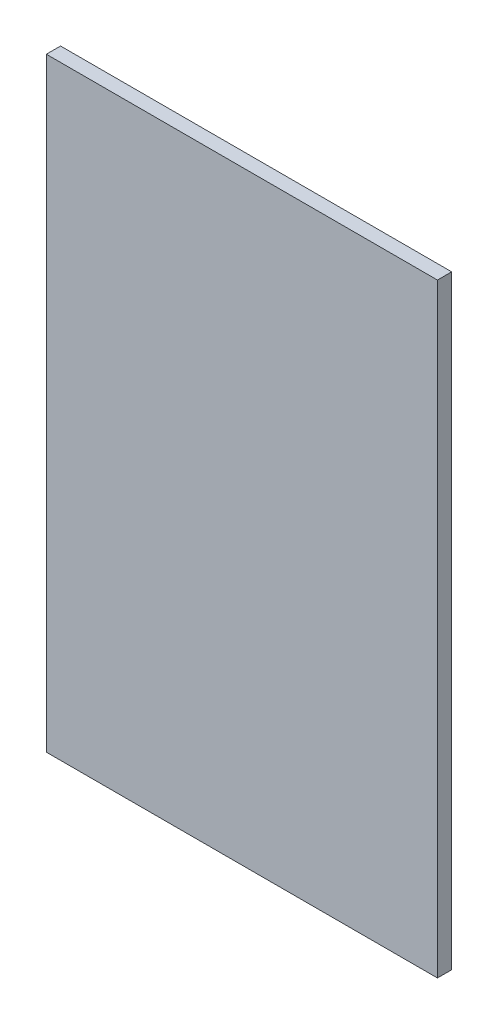
ISO-10303-21;
HEADER;
FILE_DESCRIPTION(('STEP AP214'),'2;1');
FILE_NAME('part.step','',(''),(''),'','','');
FILE_SCHEMA(('AUTOMOTIVE_DESIGN { 1 0 10303 214 1 1 1 1 }'));
ENDSEC;
DATA;
#1=APPLICATION_CONTEXT('core data for automotive mechanical design processes');
#2=APPLICATION_PROTOCOL_DEFINITION('international standard','automotive_design',2000,#1);
#3=PRODUCT_CONTEXT('',#1,'mechanical');
#4=PRODUCT('Part','Part','',(#3));
#5=PRODUCT_RELATED_PRODUCT_CATEGORY('part','',(#4));
#6=PRODUCT_DEFINITION_FORMATION('','',#4);
#7=PRODUCT_DEFINITION_CONTEXT('part definition',#1,'design');
#8=PRODUCT_DEFINITION('design','',#6,#7);
#9=PRODUCT_DEFINITION_SHAPE('','',#8);
#10=(LENGTH_UNIT() NAMED_UNIT(*) SI_UNIT(.MILLI.,.METRE.));
#11=(NAMED_UNIT(*) PLANE_ANGLE_UNIT() SI_UNIT($,.RADIAN.));
#12=(NAMED_UNIT(*) SI_UNIT($,.STERADIAN.) SOLID_ANGLE_UNIT());
#13=UNCERTAINTY_MEASURE_WITH_UNIT(LENGTH_MEASURE(1.E-05),#10,'distance_accuracy_value','');
#14=(GEOMETRIC_REPRESENTATION_CONTEXT(3) GLOBAL_UNCERTAINTY_ASSIGNED_CONTEXT((#13)) GLOBAL_UNIT_ASSIGNED_CONTEXT((#10,
#11,#12)) REPRESENTATION_CONTEXT('',''));
#15=CARTESIAN_POINT('',(0.,0.,0.));
#16=DIRECTION('',(0.,0.,1.));
#17=DIRECTION('',(1.,0.,0.));
#18=AXIS2_PLACEMENT_3D('',#15,#16,#17);
#19=CARTESIAN_POINT('',(-9.70588235294119,170.,-7.87254901960784));
#20=DIRECTION('',(1.,0.,0.));
#21=DIRECTION('',(0.,0.,-1.));
#22=AXIS2_PLACEMENT_3D('',#19,#20,#21);
#23=PLANE('',#22);
#24=DIRECTION('',(0.,0.,1.));
#25=VECTOR('',#24,1.);
#26=CARTESIAN_POINT('',(-9.70588235294119,0.,-7.87254901960784));
#27=LINE('',#26,#25);
#28=CARTESIAN_POINT('',(-9.70588235294119,0.,-7.87254901960784));
#29=VERTEX_POINT('',#28);
#30=CARTESIAN_POINT('',(-9.7058823529412,0.,-3.87254901960784));
#31=VERTEX_POINT('',#30);
#32=EDGE_CURVE('E107',#29,#31,#27,.T.);
#33=ORIENTED_EDGE('',*,*,#32,.T.);
#34=DIRECTION('',(0.,-1.,0.));
#35=VECTOR('',#34,1.);
#36=CARTESIAN_POINT('',(-9.7058823529412,170.,-3.87254901960784));
#37=LINE('',#36,#35);
#38=CARTESIAN_POINT('',(-9.7058823529412,170.,-3.87254901960784));
#39=VERTEX_POINT('',#38);
#40=EDGE_CURVE('E11',#39,#31,#37,.T.);
#41=ORIENTED_EDGE('',*,*,#40,.F.);
#42=DIRECTION('',(0.,0.,1.));
#43=VECTOR('',#42,1.);
#44=CARTESIAN_POINT('',(-9.70588235294119,170.,-7.87254901960784));
#45=LINE('',#44,#43);
#46=CARTESIAN_POINT('',(-9.70588235294119,170.,-7.87254901960784));
#47=VERTEX_POINT('',#46);
#48=EDGE_CURVE('E91',#47,#39,#45,.T.);
#49=ORIENTED_EDGE('',*,*,#48,.F.);
#50=DIRECTION('',(0.,-1.,0.));
#51=VECTOR('',#50,1.);
#52=CARTESIAN_POINT('',(-9.70588235294119,170.,-7.87254901960784));
#53=LINE('',#52,#51);
#54=EDGE_CURVE('E103',#47,#29,#53,.T.);
#55=ORIENTED_EDGE('',*,*,#54,.T.);
#56=EDGE_LOOP('',(#33,#41,#49,#55));
#57=FACE_BOUND('',#56,.T.);
#58=ADVANCED_FACE('F39',(#57),#23,.F.);
#59=CARTESIAN_POINT('',(-9.7058823529412,170.,-3.87254901960784));
#60=DIRECTION('',(0.,0.,-1.));
#61=DIRECTION('',(-1.,0.,0.));
#62=AXIS2_PLACEMENT_3D('',#59,#60,#61);
#63=PLANE('',#62);
#64=DIRECTION('',(1.,0.,0.));
#65=VECTOR('',#64,1.);
#66=CARTESIAN_POINT('',(-9.7058823529412,0.,-3.87254901960784));
#67=LINE('',#66,#65);
#68=CARTESIAN_POINT('',(100.294117647059,0.,-3.87254901960784));
#69=VERTEX_POINT('',#68);
#70=EDGE_CURVE('E96',#31,#69,#67,.T.);
#71=ORIENTED_EDGE('',*,*,#70,.T.);
#72=DIRECTION('',(0.,-1.,0.));
#73=VECTOR('',#72,1.);
#74=CARTESIAN_POINT('',(100.294117647059,170.,-3.87254901960784));
#75=LINE('',#74,#73);
#76=CARTESIAN_POINT('',(100.294117647059,170.,-3.87254901960784));
#77=VERTEX_POINT('',#76);
#78=EDGE_CURVE('E48',#77,#69,#75,.T.);
#79=ORIENTED_EDGE('',*,*,#78,.F.);
#80=DIRECTION('',(1.,0.,0.));
#81=VECTOR('',#80,1.);
#82=CARTESIAN_POINT('',(-9.7058823529412,170.,-3.87254901960784));
#83=LINE('',#82,#81);
#84=EDGE_CURVE('E86',#39,#77,#83,.T.);
#85=ORIENTED_EDGE('',*,*,#84,.F.);
#86=ORIENTED_EDGE('',*,*,#40,.T.);
#87=EDGE_LOOP('',(#71,#79,#85,#86));
#88=FACE_BOUND('',#87,.T.);
#89=ADVANCED_FACE('F95',(#88),#63,.F.);
#90=CARTESIAN_POINT('',(100.294117647059,170.,-7.87254901960784));
#91=DIRECTION('',(-1.,0.,0.));
#92=DIRECTION('',(0.,0.,1.));
#93=AXIS2_PLACEMENT_3D('',#90,#91,#92);
#94=PLANE('',#93);
#95=DIRECTION('',(0.,0.,-1.));
#96=VECTOR('',#95,1.);
#97=CARTESIAN_POINT('',(100.294117647059,0.,-7.87254901960784));
#98=LINE('',#97,#96);
#99=CARTESIAN_POINT('',(100.294117647059,0.,-7.87254901960784));
#100=VERTEX_POINT('',#99);
#101=EDGE_CURVE('E73',#69,#100,#98,.T.);
#102=ORIENTED_EDGE('',*,*,#101,.T.);
#103=DIRECTION('',(0.,-1.,0.));
#104=VECTOR('',#103,1.);
#105=CARTESIAN_POINT('',(100.294117647059,170.,-7.87254901960784));
#106=LINE('',#105,#104);
#107=CARTESIAN_POINT('',(100.294117647059,170.,-7.87254901960784));
#108=VERTEX_POINT('',#107);
#109=EDGE_CURVE('E98',#108,#100,#106,.T.);
#110=ORIENTED_EDGE('',*,*,#109,.F.);
#111=DIRECTION('',(0.,0.,-1.));
#112=VECTOR('',#111,1.);
#113=CARTESIAN_POINT('',(100.294117647059,170.,-7.87254901960784));
#114=LINE('',#113,#112);
#115=EDGE_CURVE('E89',#77,#108,#114,.T.);
#116=ORIENTED_EDGE('',*,*,#115,.F.);
#117=ORIENTED_EDGE('',*,*,#78,.T.);
#118=EDGE_LOOP('',(#102,#110,#116,#117));
#119=FACE_BOUND('',#118,.T.);
#120=ADVANCED_FACE('F99',(#119),#94,.F.);
#121=CARTESIAN_POINT('',(-9.70588235294119,170.,-7.87254901960784));
#122=DIRECTION('',(0.,0.,1.));
#123=DIRECTION('',(1.,0.,0.));
#124=AXIS2_PLACEMENT_3D('',#121,#122,#123);
#125=PLANE('',#124);
#126=DIRECTION('',(-1.,0.,0.));
#127=VECTOR('',#126,1.);
#128=CARTESIAN_POINT('',(-9.70588235294119,0.,-7.87254901960784));
#129=LINE('',#128,#127);
#130=EDGE_CURVE('E79',#100,#29,#129,.T.);
#131=ORIENTED_EDGE('',*,*,#130,.T.);
#132=ORIENTED_EDGE('',*,*,#54,.F.);
#133=DIRECTION('',(-1.,0.,0.));
#134=VECTOR('',#133,1.);
#135=CARTESIAN_POINT('',(-9.70588235294119,170.,-7.87254901960784));
#136=LINE('',#135,#134);
#137=EDGE_CURVE('E56',#108,#47,#136,.T.);
#138=ORIENTED_EDGE('',*,*,#137,.F.);
#139=ORIENTED_EDGE('',*,*,#109,.T.);
#140=EDGE_LOOP('',(#131,#132,#138,#139));
#141=FACE_BOUND('',#140,.T.);
#142=ADVANCED_FACE('F120',(#141),#125,.F.);
#143=CARTESIAN_POINT('',(0.,170.,0.));
#144=DIRECTION('',(0.,1.,0.));
#145=DIRECTION('',(0.,0.,1.));
#146=AXIS2_PLACEMENT_3D('',#143,#144,#145);
#147=PLANE('',#146);
#148=ORIENTED_EDGE('',*,*,#48,.T.);
#149=ORIENTED_EDGE('',*,*,#84,.T.);
#150=ORIENTED_EDGE('',*,*,#115,.T.);
#151=ORIENTED_EDGE('',*,*,#137,.T.);
#152=EDGE_LOOP('',(#148,#149,#150,#151));
#153=FACE_BOUND('',#152,.T.);
#154=ADVANCED_FACE('F87',(#153),#147,.T.);
#155=CARTESIAN_POINT('',(0.,0.,0.));
#156=DIRECTION('',(0.,1.,0.));
#157=DIRECTION('',(0.,0.,1.));
#158=AXIS2_PLACEMENT_3D('',#155,#156,#157);
#159=PLANE('',#158);
#160=ORIENTED_EDGE('',*,*,#32,.F.);
#161=ORIENTED_EDGE('',*,*,#130,.F.);
#162=ORIENTED_EDGE('',*,*,#101,.F.);
#163=ORIENTED_EDGE('',*,*,#70,.F.);
#164=EDGE_LOOP('',(#160,#161,#162,#163));
#165=FACE_BOUND('',#164,.T.);
#166=ADVANCED_FACE('F123',(#165),#159,.F.);
#167=CLOSED_SHELL('',(#58,#89,#120,#142,#154,#166));
#168=MANIFOLD_SOLID_BREP('B2',#167);
#169=ADVANCED_BREP_SHAPE_REPRESENTATION('',(#18,#168),#14);
#170=SHAPE_DEFINITION_REPRESENTATION(#9,#169);
ENDSEC;
END-ISO-10303-21;
